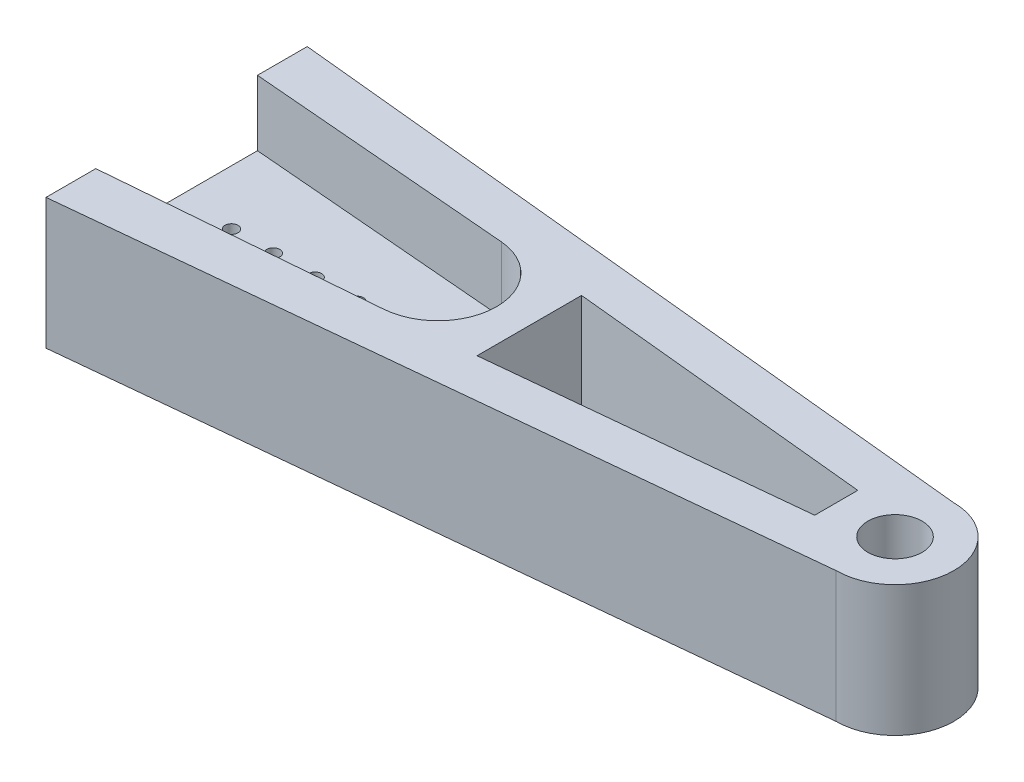
ISO-10303-21;
HEADER;
FILE_DESCRIPTION(('STEP AP214'),'2;1');
FILE_NAME('part.step','',(''),(''),'','','');
FILE_SCHEMA(('AUTOMOTIVE_DESIGN { 1 0 10303 214 1 1 1 1 }'));
ENDSEC;
DATA;
#1=APPLICATION_CONTEXT('core data for automotive mechanical design processes');
#2=APPLICATION_PROTOCOL_DEFINITION('international standard','automotive_design',2000,#1);
#3=PRODUCT_CONTEXT('',#1,'mechanical');
#4=PRODUCT('Part','Part','',(#3));
#5=PRODUCT_RELATED_PRODUCT_CATEGORY('part','',(#4));
#6=PRODUCT_DEFINITION_FORMATION('','',#4);
#7=PRODUCT_DEFINITION_CONTEXT('part definition',#1,'design');
#8=PRODUCT_DEFINITION('design','',#6,#7);
#9=PRODUCT_DEFINITION_SHAPE('','',#8);
#10=(LENGTH_UNIT() NAMED_UNIT(*) SI_UNIT(.MILLI.,.METRE.));
#11=(NAMED_UNIT(*) PLANE_ANGLE_UNIT() SI_UNIT($,.RADIAN.));
#12=(NAMED_UNIT(*) SI_UNIT($,.STERADIAN.) SOLID_ANGLE_UNIT());
#13=UNCERTAINTY_MEASURE_WITH_UNIT(LENGTH_MEASURE(1.E-05),#10,'distance_accuracy_value','');
#14=(GEOMETRIC_REPRESENTATION_CONTEXT(3) GLOBAL_UNCERTAINTY_ASSIGNED_CONTEXT((#13)) GLOBAL_UNIT_ASSIGNED_CONTEXT((#10,
#11,#12)) REPRESENTATION_CONTEXT('',''));
#15=CARTESIAN_POINT('',(0.,0.,0.));
#16=DIRECTION('',(0.,0.,1.));
#17=DIRECTION('',(1.,0.,0.));
#18=AXIS2_PLACEMENT_3D('',#15,#16,#17);
#19=CARTESIAN_POINT('',(0.,0.,0.));
#20=DIRECTION('',(0.,1.,0.));
#21=DIRECTION('',(0.,0.,1.));
#22=AXIS2_PLACEMENT_3D('',#19,#20,#21);
#23=PLANE('',#22);
#24=CARTESIAN_POINT('',(65.,0.,0.));
#25=DIRECTION('',(0.,1.,0.));
#26=DIRECTION('',(0.,0.,1.));
#27=AXIS2_PLACEMENT_3D('',#24,#25,#26);
#28=CIRCLE('',#27,2.07499999999999);
#29=CARTESIAN_POINT('',(65.,0.,2.07499999999999));
#30=VERTEX_POINT('',#29);
#31=EDGE_CURVE('E264',#30,#30,#28,.T.);
#32=ORIENTED_EDGE('',*,*,#31,.T.);
#33=EDGE_LOOP('',(#32));
#34=FACE_BOUND('',#33,.T.);
#35=CARTESIAN_POINT('',(65.,0.,0.));
#36=DIRECTION('',(0.,1.,0.));
#37=DIRECTION('',(0.,0.,1.));
#38=AXIS2_PLACEMENT_3D('',#35,#36,#37);
#39=CIRCLE('',#38,2.1);
#40=CARTESIAN_POINT('',(65.,0.,2.1));
#41=VERTEX_POINT('',#40);
#42=EDGE_CURVE('E11',#41,#41,#39,.T.);
#43=ORIENTED_EDGE('',*,*,#42,.F.);
#44=EDGE_LOOP('',(#43));
#45=FACE_BOUND('',#44,.T.);
#46=ADVANCED_FACE('F49',(#34,#45),#23,.F.);
#47=CARTESIAN_POINT('',(65.,5.,0.));
#48=DIRECTION('',(0.,-1.,0.));
#49=DIRECTION('',(0.,0.,-1.));
#50=AXIS2_PLACEMENT_3D('',#47,#48,#49);
#51=CYLINDRICAL_SURFACE('',#50,4.5);
#52=DIRECTION('',(0.,-1.,0.));
#53=VECTOR('',#52,1.);
#54=CARTESIAN_POINT('',(65.,5.,4.5));
#55=LINE('',#54,#53);
#56=CARTESIAN_POINT('',(65.,5.,4.5));
#57=VERTEX_POINT('',#56);
#58=CARTESIAN_POINT('',(65.,-5.,4.5));
#59=VERTEX_POINT('',#58);
#60=EDGE_CURVE('E291',#57,#59,#55,.T.);
#61=ORIENTED_EDGE('',*,*,#60,.T.);
#62=CARTESIAN_POINT('',(65.,-5.,0.));
#63=DIRECTION('',(0.,1.,0.));
#64=DIRECTION('',(0.,0.,-1.));
#65=AXIS2_PLACEMENT_3D('',#62,#63,#64);
#66=CIRCLE('',#65,4.5);
#67=CARTESIAN_POINT('',(65.,-5.,-4.5));
#68=VERTEX_POINT('',#67);
#69=EDGE_CURVE('E252',#59,#68,#66,.T.);
#70=ORIENTED_EDGE('',*,*,#69,.T.);
#71=DIRECTION('',(0.,-1.,0.));
#72=VECTOR('',#71,1.);
#73=CARTESIAN_POINT('',(65.,5.,-4.5));
#74=LINE('',#73,#72);
#75=CARTESIAN_POINT('',(65.,5.,-4.5));
#76=VERTEX_POINT('',#75);
#77=EDGE_CURVE('E53',#76,#68,#74,.T.);
#78=ORIENTED_EDGE('',*,*,#77,.F.);
#79=CARTESIAN_POINT('',(65.,5.,0.));
#80=DIRECTION('',(0.,1.,0.));
#81=DIRECTION('',(0.,0.,1.));
#82=AXIS2_PLACEMENT_3D('',#79,#80,#81);
#83=CIRCLE('',#82,4.5);
#84=EDGE_CURVE('E259',#76,#57,#83,.F.);
#85=ORIENTED_EDGE('',*,*,#84,.T.);
#86=EDGE_LOOP('',(#61,#70,#78,#85));
#87=FACE_BOUND('',#86,.T.);
#88=ADVANCED_FACE('F51',(#87),#51,.T.);
#89=CARTESIAN_POINT('',(1.08910891089109,5.,-10.8910891089109));
#90=DIRECTION('',(0.0995037190209989,0.,-0.995037190209989));
#91=DIRECTION('',(-0.995037190209989,0.,-0.0995037190209989));
#92=AXIS2_PLACEMENT_3D('',#89,#90,#91);
#93=PLANE('',#92);
#94=ORIENTED_EDGE('',*,*,#77,.T.);
#95=DIRECTION('',(-0.995037190209989,0.,-0.0995037190209989));
#96=VECTOR('',#95,1.);
#97=CARTESIAN_POINT('',(10.,-5.,-10.));
#98=LINE('',#97,#96);
#99=CARTESIAN_POINT('',(10.,-5.,-10.));
#100=VERTEX_POINT('',#99);
#101=EDGE_CURVE('E240',#68,#100,#98,.T.);
#102=ORIENTED_EDGE('',*,*,#101,.T.);
#103=DIRECTION('',(0.,-1.,0.));
#104=VECTOR('',#103,1.);
#105=CARTESIAN_POINT('',(10.,5.,-10.));
#106=LINE('',#105,#104);
#107=CARTESIAN_POINT('',(10.,5.,-10.));
#108=VERTEX_POINT('',#107);
#109=EDGE_CURVE('E325',#108,#100,#106,.T.);
#110=ORIENTED_EDGE('',*,*,#109,.F.);
#111=DIRECTION('',(0.995037190209989,0.,0.0995037190209989));
#112=VECTOR('',#111,1.);
#113=CARTESIAN_POINT('',(1.08910891089109,5.,-10.8910891089109));
#114=LINE('',#113,#112);
#115=EDGE_CURVE('E263',#108,#76,#114,.T.);
#116=ORIENTED_EDGE('',*,*,#115,.T.);
#117=EDGE_LOOP('',(#94,#102,#110,#116));
#118=FACE_BOUND('',#117,.T.);
#119=ADVANCED_FACE('F333',(#118),#93,.T.);
#120=CARTESIAN_POINT('',(0.583333333333335,5.,-6.97565210014248));
#121=DIRECTION('',(0.0833333333333335,0.,-0.996521728591783));
#122=DIRECTION('',(-0.996521728591783,0.,-0.0833333333333335));
#123=AXIS2_PLACEMENT_3D('',#120,#121,#122);
#124=PLANE('',#123);
#125=DIRECTION('',(0.996521728591783,0.,0.0833333333333335));
#126=VECTOR('',#125,1.);
#127=CARTESIAN_POINT('',(0.583333333333335,0.,-6.97565210014248));
#128=LINE('',#127,#126);
#129=CARTESIAN_POINT('',(10.,0.,-6.18819087405247));
#130=VERTEX_POINT('',#129);
#131=CARTESIAN_POINT('',(30.375,0.,-4.48434777866302));
#132=VERTEX_POINT('',#131);
#133=EDGE_CURVE('E256',#130,#132,#128,.T.);
#134=ORIENTED_EDGE('',*,*,#133,.T.);
#135=DIRECTION('',(0.,-1.,0.));
#136=VECTOR('',#135,1.);
#137=CARTESIAN_POINT('',(30.375,5.,-4.48434777866302));
#138=LINE('',#137,#136);
#139=CARTESIAN_POINT('',(30.375,5.,-4.48434777866302));
#140=VERTEX_POINT('',#139);
#141=EDGE_CURVE('E318',#140,#132,#138,.T.);
#142=ORIENTED_EDGE('',*,*,#141,.F.);
#143=DIRECTION('',(0.996521728591783,0.,0.0833333333333335));
#144=VECTOR('',#143,1.);
#145=CARTESIAN_POINT('',(0.583333333333335,5.,-6.97565210014248));
#146=LINE('',#145,#144);
#147=CARTESIAN_POINT('',(10.,5.,-6.18819087405247));
#148=VERTEX_POINT('',#147);
#149=EDGE_CURVE('E271',#148,#140,#146,.T.);
#150=ORIENTED_EDGE('',*,*,#149,.F.);
#151=DIRECTION('',(0.,-1.,0.));
#152=VECTOR('',#151,1.);
#153=CARTESIAN_POINT('',(10.,5.,-6.18819087405247));
#154=LINE('',#153,#152);
#155=EDGE_CURVE('E322',#148,#130,#154,.T.);
#156=ORIENTED_EDGE('',*,*,#155,.T.);
#157=EDGE_LOOP('',(#134,#142,#150,#156));
#158=FACE_BOUND('',#157,.T.);
#159=ADVANCED_FACE('F360',(#158),#124,.F.);
#160=CARTESIAN_POINT('',(30.,5.,0.));
#161=DIRECTION('',(0.,-1.,0.));
#162=DIRECTION('',(0.,0.,-1.));
#163=AXIS2_PLACEMENT_3D('',#160,#161,#162);
#164=CYLINDRICAL_SURFACE('',#163,4.5);
#165=CARTESIAN_POINT('',(30.,0.,0.));
#166=DIRECTION('',(0.,1.,0.));
#167=DIRECTION('',(0.,0.,1.));
#168=AXIS2_PLACEMENT_3D('',#165,#166,#167);
#169=CIRCLE('',#168,4.5);
#170=CARTESIAN_POINT('',(30.375,0.,4.48434777866302));
#171=VERTEX_POINT('',#170);
#172=EDGE_CURVE('E295',#132,#171,#169,.F.);
#173=ORIENTED_EDGE('',*,*,#172,.T.);
#174=DIRECTION('',(0.,-1.,0.));
#175=VECTOR('',#174,1.);
#176=CARTESIAN_POINT('',(30.375,5.,4.48434777866302));
#177=LINE('',#176,#175);
#178=CARTESIAN_POINT('',(30.375,5.,4.48434777866302));
#179=VERTEX_POINT('',#178);
#180=EDGE_CURVE('E314',#179,#171,#177,.T.);
#181=ORIENTED_EDGE('',*,*,#180,.F.);
#182=CARTESIAN_POINT('',(30.,5.,0.));
#183=DIRECTION('',(0.,1.,0.));
#184=DIRECTION('',(0.,0.,1.));
#185=AXIS2_PLACEMENT_3D('',#182,#183,#184);
#186=CIRCLE('',#185,4.5);
#187=EDGE_CURVE('E274',#140,#179,#186,.F.);
#188=ORIENTED_EDGE('',*,*,#187,.F.);
#189=ORIENTED_EDGE('',*,*,#141,.T.);
#190=EDGE_LOOP('',(#173,#181,#188,#189));
#191=FACE_BOUND('',#190,.T.);
#192=ADVANCED_FACE('F363',(#191),#164,.F.);
#193=CARTESIAN_POINT('',(0.583333333333332,5.,6.97565210014248));
#194=DIRECTION('',(-0.0833333333333332,0.,-0.996521728591783));
#195=DIRECTION('',(-0.996521728591783,0.,0.0833333333333332));
#196=AXIS2_PLACEMENT_3D('',#193,#194,#195);
#197=PLANE('',#196);
#198=DIRECTION('',(0.996521728591783,0.,-0.0833333333333332));
#199=VECTOR('',#198,1.);
#200=CARTESIAN_POINT('',(0.583333333333332,0.,6.97565210014248));
#201=LINE('',#200,#199);
#202=CARTESIAN_POINT('',(10.,0.,6.18819087405246));
#203=VERTEX_POINT('',#202);
#204=EDGE_CURVE('E299',#203,#171,#201,.T.);
#205=ORIENTED_EDGE('',*,*,#204,.F.);
#206=DIRECTION('',(0.,-1.,0.));
#207=VECTOR('',#206,1.);
#208=CARTESIAN_POINT('',(10.,5.,6.18819087405247));
#209=LINE('',#208,#207);
#210=CARTESIAN_POINT('',(10.,5.,6.18819087405247));
#211=VERTEX_POINT('',#210);
#212=EDGE_CURVE('E310',#211,#203,#209,.T.);
#213=ORIENTED_EDGE('',*,*,#212,.F.);
#214=DIRECTION('',(0.996521728591783,0.,-0.0833333333333332));
#215=VECTOR('',#214,1.);
#216=CARTESIAN_POINT('',(0.583333333333332,5.,6.97565210014248));
#217=LINE('',#216,#215);
#218=EDGE_CURVE('E277',#211,#179,#217,.T.);
#219=ORIENTED_EDGE('',*,*,#218,.T.);
#220=ORIENTED_EDGE('',*,*,#180,.T.);
#221=EDGE_LOOP('',(#205,#213,#219,#220));
#222=FACE_BOUND('',#221,.T.);
#223=ADVANCED_FACE('F354',(#222),#197,.T.);
#224=CARTESIAN_POINT('',(10.,5.,0.));
#225=DIRECTION('',(1.,0.,0.));
#226=DIRECTION('',(0.,0.,-1.));
#227=AXIS2_PLACEMENT_3D('',#224,#225,#226);
#228=PLANE('',#227);
#229=ORIENTED_EDGE('',*,*,#212,.T.);
#230=DIRECTION('',(0.,0.,1.));
#231=VECTOR('',#230,1.);
#232=CARTESIAN_POINT('',(10.,0.,-10.));
#233=LINE('',#232,#231);
#234=EDGE_CURVE('E236',#130,#203,#233,.T.);
#235=ORIENTED_EDGE('',*,*,#234,.F.);
#236=ORIENTED_EDGE('',*,*,#155,.F.);
#237=DIRECTION('',(0.,0.,1.));
#238=VECTOR('',#237,1.);
#239=CARTESIAN_POINT('',(10.,5.,0.));
#240=LINE('',#239,#238);
#241=EDGE_CURVE('E268',#108,#148,#240,.T.);
#242=ORIENTED_EDGE('',*,*,#241,.F.);
#243=ORIENTED_EDGE('',*,*,#109,.T.);
#244=DIRECTION('',(0.,0.,1.));
#245=VECTOR('',#244,1.);
#246=CARTESIAN_POINT('',(10.,-5.,-10.));
#247=LINE('',#246,#245);
#248=CARTESIAN_POINT('',(10.,-5.,10.));
#249=VERTEX_POINT('',#248);
#250=EDGE_CURVE('E244',#100,#249,#247,.T.);
#251=ORIENTED_EDGE('',*,*,#250,.T.);
#252=DIRECTION('',(0.,-1.,0.));
#253=VECTOR('',#252,1.);
#254=CARTESIAN_POINT('',(10.,5.,10.));
#255=LINE('',#254,#253);
#256=CARTESIAN_POINT('',(10.,5.,10.));
#257=VERTEX_POINT('',#256);
#258=EDGE_CURVE('E307',#257,#249,#255,.T.);
#259=ORIENTED_EDGE('',*,*,#258,.F.);
#260=DIRECTION('',(0.,0.,1.));
#261=VECTOR('',#260,1.);
#262=CARTESIAN_POINT('',(10.,5.,0.));
#263=LINE('',#262,#261);
#264=EDGE_CURVE('E281',#211,#257,#263,.T.);
#265=ORIENTED_EDGE('',*,*,#264,.F.);
#266=EDGE_LOOP('',(#229,#235,#236,#242,#243,#251,#259,#265));
#267=FACE_BOUND('',#266,.T.);
#268=ADVANCED_FACE('F346',(#267),#228,.F.);
#269=CARTESIAN_POINT('',(1.08910891089109,5.,10.8910891089109));
#270=DIRECTION('',(-0.0995037190209989,0.,-0.995037190209989));
#271=DIRECTION('',(-0.995037190209989,0.,0.0995037190209989));
#272=AXIS2_PLACEMENT_3D('',#269,#270,#271);
#273=PLANE('',#272);
#274=ORIENTED_EDGE('',*,*,#258,.T.);
#275=DIRECTION('',(0.995037190209989,0.,-0.0995037190209988));
#276=VECTOR('',#275,1.);
#277=CARTESIAN_POINT('',(10.,-5.,10.));
#278=LINE('',#277,#276);
#279=EDGE_CURVE('E248',#249,#59,#278,.T.);
#280=ORIENTED_EDGE('',*,*,#279,.T.);
#281=ORIENTED_EDGE('',*,*,#60,.F.);
#282=DIRECTION('',(0.995037190209989,0.,-0.0995037190209989));
#283=VECTOR('',#282,1.);
#284=CARTESIAN_POINT('',(1.08910891089109,5.,10.8910891089109));
#285=LINE('',#284,#283);
#286=EDGE_CURVE('E284',#257,#57,#285,.T.);
#287=ORIENTED_EDGE('',*,*,#286,.F.);
#288=EDGE_LOOP('',(#274,#280,#281,#287));
#289=FACE_BOUND('',#288,.T.);
#290=ADVANCED_FACE('F344',(#289),#273,.F.);
#291=CARTESIAN_POINT('',(65.,5.,0.));
#292=DIRECTION('',(0.,-1.,0.));
#293=DIRECTION('',(0.,0.,-1.));
#294=AXIS2_PLACEMENT_3D('',#291,#292,#293);
#295=CYLINDRICAL_SURFACE('',#294,2.07499999999999);
#296=CARTESIAN_POINT('',(65.,5.,0.));
#297=DIRECTION('',(0.,1.,0.));
#298=DIRECTION('',(0.,0.,1.));
#299=AXIS2_PLACEMENT_3D('',#296,#297,#298);
#300=CIRCLE('',#299,2.07499999999999);
#301=CARTESIAN_POINT('',(65.,5.,2.07499999999999));
#302=VERTEX_POINT('',#301);
#303=EDGE_CURVE('E287',#302,#302,#300,.T.);
#304=ORIENTED_EDGE('',*,*,#303,.T.);
#305=EDGE_LOOP('',(#304));
#306=FACE_BOUND('',#305,.T.);
#307=ORIENTED_EDGE('',*,*,#31,.F.);
#308=EDGE_LOOP('',(#307));
#309=FACE_BOUND('',#308,.T.);
#310=ADVANCED_FACE('F377',(#306,#309),#295,.F.);
#311=CARTESIAN_POINT('',(0.,5.,0.));
#312=DIRECTION('',(0.,1.,0.));
#313=DIRECTION('',(0.,0.,1.));
#314=AXIS2_PLACEMENT_3D('',#311,#312,#313);
#315=PLANE('',#314);
#316=DIRECTION('',(-0.995037190209989,0.,-0.0995037190209988));
#317=VECTOR('',#316,1.);
#318=CARTESIAN_POINT('',(60.5,5.,-1.65));
#319=LINE('',#318,#317);
#320=CARTESIAN_POINT('',(60.5,5.,-1.65));
#321=VERTEX_POINT('',#320);
#322=CARTESIAN_POINT('',(37.,5.,-4.));
#323=VERTEX_POINT('',#322);
#324=EDGE_CURVE('E66',#321,#323,#319,.T.);
#325=ORIENTED_EDGE('',*,*,#324,.F.);
#326=DIRECTION('',(0.,0.,-1.));
#327=VECTOR('',#326,1.);
#328=CARTESIAN_POINT('',(60.5,5.,1.65));
#329=LINE('',#328,#327);
#330=CARTESIAN_POINT('',(60.5,5.,1.65));
#331=VERTEX_POINT('',#330);
#332=EDGE_CURVE('E160',#331,#321,#329,.T.);
#333=ORIENTED_EDGE('',*,*,#332,.F.);
#334=DIRECTION('',(0.995037190209989,0.,-0.0995037190209989));
#335=VECTOR('',#334,1.);
#336=CARTESIAN_POINT('',(37.,5.,4.));
#337=LINE('',#336,#335);
#338=CARTESIAN_POINT('',(37.,5.,4.));
#339=VERTEX_POINT('',#338);
#340=EDGE_CURVE('E142',#339,#331,#337,.T.);
#341=ORIENTED_EDGE('',*,*,#340,.F.);
#342=DIRECTION('',(0.,0.,1.));
#343=VECTOR('',#342,1.);
#344=CARTESIAN_POINT('',(37.,5.,-4.));
#345=LINE('',#344,#343);
#346=EDGE_CURVE('E152',#323,#339,#345,.T.);
#347=ORIENTED_EDGE('',*,*,#346,.F.);
#348=EDGE_LOOP('',(#325,#333,#341,#347));
#349=FACE_BOUND('',#348,.T.);
#350=ORIENTED_EDGE('',*,*,#84,.F.);
#351=ORIENTED_EDGE('',*,*,#115,.F.);
#352=ORIENTED_EDGE('',*,*,#241,.T.);
#353=ORIENTED_EDGE('',*,*,#149,.T.);
#354=ORIENTED_EDGE('',*,*,#187,.T.);
#355=ORIENTED_EDGE('',*,*,#218,.F.);
#356=ORIENTED_EDGE('',*,*,#264,.T.);
#357=ORIENTED_EDGE('',*,*,#286,.T.);
#358=EDGE_LOOP('',(#350,#351,#352,#353,#354,#355,#356,#357));
#359=FACE_BOUND('',#358,.T.);
#360=ORIENTED_EDGE('',*,*,#303,.F.);
#361=EDGE_LOOP('',(#360));
#362=FACE_BOUND('',#361,.T.);
#363=ADVANCED_FACE('F157',(#349,#359,#362),#315,.T.);
#364=CARTESIAN_POINT('',(65.,0.,0.));
#365=DIRECTION('',(0.,-1.,0.));
#366=DIRECTION('',(0.,0.,-1.));
#367=AXIS2_PLACEMENT_3D('',#364,#365,#366);
#368=PLANE('',#367);
#369=CARTESIAN_POINT('',(14.2,0.,0.));
#370=DIRECTION('',(0.,1.,0.));
#371=DIRECTION('',(0.,0.,1.));
#372=AXIS2_PLACEMENT_3D('',#369,#370,#371);
#373=CIRCLE('',#372,0.500000000000001);
#374=CARTESIAN_POINT('',(14.2,0.,0.500000000000001));
#375=VERTEX_POINT('',#374);
#376=EDGE_CURVE('E230',#375,#375,#373,.T.);
#377=ORIENTED_EDGE('',*,*,#376,.F.);
#378=EDGE_LOOP('',(#377));
#379=FACE_BOUND('',#378,.T.);
#380=CARTESIAN_POINT('',(17.4,0.,0.));
#381=DIRECTION('',(0.,1.,0.));
#382=DIRECTION('',(0.,0.,1.));
#383=AXIS2_PLACEMENT_3D('',#380,#381,#382);
#384=CIRCLE('',#383,0.499999999999999);
#385=CARTESIAN_POINT('',(17.4,0.,0.499999999999999));
#386=VERTEX_POINT('',#385);
#387=EDGE_CURVE('E216',#386,#386,#384,.T.);
#388=ORIENTED_EDGE('',*,*,#387,.F.);
#389=EDGE_LOOP('',(#388));
#390=FACE_BOUND('',#389,.T.);
#391=CARTESIAN_POINT('',(20.6,0.,0.));
#392=DIRECTION('',(0.,1.,0.));
#393=DIRECTION('',(0.,0.,1.));
#394=AXIS2_PLACEMENT_3D('',#391,#392,#393);
#395=CIRCLE('',#394,0.500000000000002);
#396=CARTESIAN_POINT('',(20.6,0.,0.500000000000002));
#397=VERTEX_POINT('',#396);
#398=EDGE_CURVE('E208',#397,#397,#395,.T.);
#399=ORIENTED_EDGE('',*,*,#398,.F.);
#400=EDGE_LOOP('',(#399));
#401=FACE_BOUND('',#400,.T.);
#402=CARTESIAN_POINT('',(23.8,0.,0.));
#403=DIRECTION('',(0.,1.,0.));
#404=DIRECTION('',(0.,0.,1.));
#405=AXIS2_PLACEMENT_3D('',#402,#403,#404);
#406=CIRCLE('',#405,0.500000000000002);
#407=CARTESIAN_POINT('',(23.8,0.,0.500000000000002));
#408=VERTEX_POINT('',#407);
#409=EDGE_CURVE('E200',#408,#408,#406,.T.);
#410=ORIENTED_EDGE('',*,*,#409,.F.);
#411=EDGE_LOOP('',(#410));
#412=FACE_BOUND('',#411,.T.);
#413=CARTESIAN_POINT('',(27.,0.,0.));
#414=DIRECTION('',(0.,1.,0.));
#415=DIRECTION('',(0.,0.,1.));
#416=AXIS2_PLACEMENT_3D('',#413,#414,#415);
#417=CIRCLE('',#416,0.500000000000002);
#418=CARTESIAN_POINT('',(27.,0.,0.500000000000002));
#419=VERTEX_POINT('',#418);
#420=EDGE_CURVE('E192',#419,#419,#417,.T.);
#421=ORIENTED_EDGE('',*,*,#420,.F.);
#422=EDGE_LOOP('',(#421));
#423=FACE_BOUND('',#422,.T.);
#424=CARTESIAN_POINT('',(30.2,0.,0.));
#425=DIRECTION('',(0.,1.,0.));
#426=DIRECTION('',(0.,0.,1.));
#427=AXIS2_PLACEMENT_3D('',#424,#425,#426);
#428=CIRCLE('',#427,0.499999999999999);
#429=CARTESIAN_POINT('',(30.2,0.,0.499999999999999));
#430=VERTEX_POINT('',#429);
#431=EDGE_CURVE('E183',#430,#430,#428,.T.);
#432=ORIENTED_EDGE('',*,*,#431,.F.);
#433=EDGE_LOOP('',(#432));
#434=FACE_BOUND('',#433,.T.);
#435=ORIENTED_EDGE('',*,*,#234,.T.);
#436=ORIENTED_EDGE('',*,*,#204,.T.);
#437=ORIENTED_EDGE('',*,*,#172,.F.);
#438=ORIENTED_EDGE('',*,*,#133,.F.);
#439=EDGE_LOOP('',(#435,#436,#437,#438));
#440=FACE_BOUND('',#439,.T.);
#441=ADVANCED_FACE('F364',(#379,#390,#401,#412,#423,#434,#440),#368,.F.);
#442=CARTESIAN_POINT('',(65.,-5.,0.));
#443=DIRECTION('',(0.,-1.,0.));
#444=DIRECTION('',(0.,0.,-1.));
#445=AXIS2_PLACEMENT_3D('',#442,#443,#444);
#446=PLANE('',#445);
#447=DIRECTION('',(-0.995037190209989,0.,-0.0995037190209988));
#448=VECTOR('',#447,1.);
#449=CARTESIAN_POINT('',(60.5,-5.,-1.65));
#450=LINE('',#449,#448);
#451=CARTESIAN_POINT('',(60.5,-5.,-1.65));
#452=VERTEX_POINT('',#451);
#453=CARTESIAN_POINT('',(37.,-5.,-4.));
#454=VERTEX_POINT('',#453);
#455=EDGE_CURVE('E164',#452,#454,#450,.T.);
#456=ORIENTED_EDGE('',*,*,#455,.T.);
#457=DIRECTION('',(0.,0.,1.));
#458=VECTOR('',#457,1.);
#459=CARTESIAN_POINT('',(37.,-5.,-4.));
#460=LINE('',#459,#458);
#461=CARTESIAN_POINT('',(37.,-5.,4.));
#462=VERTEX_POINT('',#461);
#463=EDGE_CURVE('E171',#454,#462,#460,.T.);
#464=ORIENTED_EDGE('',*,*,#463,.T.);
#465=DIRECTION('',(0.995037190209989,0.,-0.0995037190209989));
#466=VECTOR('',#465,1.);
#467=CARTESIAN_POINT('',(37.,-5.,4.));
#468=LINE('',#467,#466);
#469=CARTESIAN_POINT('',(60.5,-5.,1.65));
#470=VERTEX_POINT('',#469);
#471=EDGE_CURVE('E74',#462,#470,#468,.T.);
#472=ORIENTED_EDGE('',*,*,#471,.T.);
#473=DIRECTION('',(0.,0.,-1.));
#474=VECTOR('',#473,1.);
#475=CARTESIAN_POINT('',(60.5,-5.,1.65));
#476=LINE('',#475,#474);
#477=EDGE_CURVE('E176',#470,#452,#476,.T.);
#478=ORIENTED_EDGE('',*,*,#477,.T.);
#479=EDGE_LOOP('',(#456,#464,#472,#478));
#480=FACE_BOUND('',#479,.T.);
#481=CARTESIAN_POINT('',(30.2,-5.,0.));
#482=DIRECTION('',(0.,1.,0.));
#483=DIRECTION('',(0.,0.,1.));
#484=AXIS2_PLACEMENT_3D('',#481,#482,#483);
#485=CIRCLE('',#484,0.499999999999999);
#486=CARTESIAN_POINT('',(30.2,-5.,0.499999999999999));
#487=VERTEX_POINT('',#486);
#488=EDGE_CURVE('E188',#487,#487,#485,.T.);
#489=ORIENTED_EDGE('',*,*,#488,.T.);
#490=EDGE_LOOP('',(#489));
#491=FACE_BOUND('',#490,.T.);
#492=CARTESIAN_POINT('',(27.,-5.,0.));
#493=DIRECTION('',(0.,1.,0.));
#494=DIRECTION('',(0.,0.,1.));
#495=AXIS2_PLACEMENT_3D('',#492,#493,#494);
#496=CIRCLE('',#495,0.500000000000002);
#497=CARTESIAN_POINT('',(27.,-5.,0.500000000000002));
#498=VERTEX_POINT('',#497);
#499=EDGE_CURVE('E196',#498,#498,#496,.T.);
#500=ORIENTED_EDGE('',*,*,#499,.T.);
#501=EDGE_LOOP('',(#500));
#502=FACE_BOUND('',#501,.T.);
#503=CARTESIAN_POINT('',(23.8,-5.,0.));
#504=DIRECTION('',(0.,1.,0.));
#505=DIRECTION('',(0.,0.,1.));
#506=AXIS2_PLACEMENT_3D('',#503,#504,#505);
#507=CIRCLE('',#506,0.500000000000002);
#508=CARTESIAN_POINT('',(23.8,-5.,0.500000000000002));
#509=VERTEX_POINT('',#508);
#510=EDGE_CURVE('E204',#509,#509,#507,.T.);
#511=ORIENTED_EDGE('',*,*,#510,.T.);
#512=EDGE_LOOP('',(#511));
#513=FACE_BOUND('',#512,.T.);
#514=CARTESIAN_POINT('',(20.6,-5.,0.));
#515=DIRECTION('',(0.,1.,0.));
#516=DIRECTION('',(0.,0.,1.));
#517=AXIS2_PLACEMENT_3D('',#514,#515,#516);
#518=CIRCLE('',#517,0.500000000000002);
#519=CARTESIAN_POINT('',(20.6,-5.,0.500000000000002));
#520=VERTEX_POINT('',#519);
#521=EDGE_CURVE('E212',#520,#520,#518,.T.);
#522=ORIENTED_EDGE('',*,*,#521,.T.);
#523=EDGE_LOOP('',(#522));
#524=FACE_BOUND('',#523,.T.);
#525=CARTESIAN_POINT('',(17.4,-5.,0.));
#526=DIRECTION('',(0.,1.,0.));
#527=DIRECTION('',(0.,0.,1.));
#528=AXIS2_PLACEMENT_3D('',#525,#526,#527);
#529=CIRCLE('',#528,0.499999999999999);
#530=CARTESIAN_POINT('',(17.4,-5.,0.499999999999999));
#531=VERTEX_POINT('',#530);
#532=EDGE_CURVE('E220',#531,#531,#529,.T.);
#533=ORIENTED_EDGE('',*,*,#532,.T.);
#534=EDGE_LOOP('',(#533));
#535=FACE_BOUND('',#534,.T.);
#536=CARTESIAN_POINT('',(65.,-5.,0.));
#537=DIRECTION('',(0.,1.,0.));
#538=DIRECTION('',(0.,0.,1.));
#539=AXIS2_PLACEMENT_3D('',#536,#537,#538);
#540=CIRCLE('',#539,2.1);
#541=CARTESIAN_POINT('',(65.,-5.,2.1));
#542=VERTEX_POINT('',#541);
#543=EDGE_CURVE('E224',#542,#542,#540,.T.);
#544=ORIENTED_EDGE('',*,*,#543,.T.);
#545=EDGE_LOOP('',(#544));
#546=FACE_BOUND('',#545,.T.);
#547=CARTESIAN_POINT('',(14.2,-5.,0.));
#548=DIRECTION('',(0.,1.,0.));
#549=DIRECTION('',(0.,0.,1.));
#550=AXIS2_PLACEMENT_3D('',#547,#548,#549);
#551=CIRCLE('',#550,0.500000000000001);
#552=CARTESIAN_POINT('',(14.2,-5.,0.500000000000001));
#553=VERTEX_POINT('',#552);
#554=EDGE_CURVE('E232',#553,#553,#551,.T.);
#555=ORIENTED_EDGE('',*,*,#554,.T.);
#556=EDGE_LOOP('',(#555));
#557=FACE_BOUND('',#556,.T.);
#558=ORIENTED_EDGE('',*,*,#101,.F.);
#559=ORIENTED_EDGE('',*,*,#69,.F.);
#560=ORIENTED_EDGE('',*,*,#279,.F.);
#561=ORIENTED_EDGE('',*,*,#250,.F.);
#562=EDGE_LOOP('',(#558,#559,#560,#561));
#563=FACE_BOUND('',#562,.T.);
#564=ADVANCED_FACE('F339',(#480,#491,#502,#513,#524,#535,#546,#557,#563),#446,.T.);
#565=CARTESIAN_POINT('',(14.2,-5.,0.));
#566=DIRECTION('',(0.,1.,0.));
#567=DIRECTION('',(0.,0.,1.));
#568=AXIS2_PLACEMENT_3D('',#565,#566,#567);
#569=CYLINDRICAL_SURFACE('',#568,0.500000000000001);
#570=ORIENTED_EDGE('',*,*,#554,.F.);
#571=EDGE_LOOP('',(#570));
#572=FACE_BOUND('',#571,.T.);
#573=ORIENTED_EDGE('',*,*,#376,.T.);
#574=EDGE_LOOP('',(#573));
#575=FACE_BOUND('',#574,.T.);
#576=ADVANCED_FACE('F373',(#572,#575),#569,.F.);
#577=CARTESIAN_POINT('',(65.,-5.,0.));
#578=DIRECTION('',(0.,1.,0.));
#579=DIRECTION('',(0.,0.,1.));
#580=AXIS2_PLACEMENT_3D('',#577,#578,#579);
#581=CYLINDRICAL_SURFACE('',#580,2.1);
#582=ORIENTED_EDGE('',*,*,#543,.F.);
#583=EDGE_LOOP('',(#582));
#584=FACE_BOUND('',#583,.T.);
#585=ORIENTED_EDGE('',*,*,#42,.T.);
#586=EDGE_LOOP('',(#585));
#587=FACE_BOUND('',#586,.T.);
#588=ADVANCED_FACE('F455',(#584,#587),#581,.F.);
#589=CARTESIAN_POINT('',(17.4,-5.,0.));
#590=DIRECTION('',(0.,1.,0.));
#591=DIRECTION('',(0.,0.,1.));
#592=AXIS2_PLACEMENT_3D('',#589,#590,#591);
#593=CYLINDRICAL_SURFACE('',#592,0.499999999999999);
#594=ORIENTED_EDGE('',*,*,#532,.F.);
#595=EDGE_LOOP('',(#594));
#596=FACE_BOUND('',#595,.T.);
#597=ORIENTED_EDGE('',*,*,#387,.T.);
#598=EDGE_LOOP('',(#597));
#599=FACE_BOUND('',#598,.T.);
#600=ADVANCED_FACE('F465',(#596,#599),#593,.F.);
#601=CARTESIAN_POINT('',(20.6,-5.,0.));
#602=DIRECTION('',(0.,1.,0.));
#603=DIRECTION('',(0.,0.,1.));
#604=AXIS2_PLACEMENT_3D('',#601,#602,#603);
#605=CYLINDRICAL_SURFACE('',#604,0.500000000000002);
#606=ORIENTED_EDGE('',*,*,#521,.F.);
#607=EDGE_LOOP('',(#606));
#608=FACE_BOUND('',#607,.T.);
#609=ORIENTED_EDGE('',*,*,#398,.T.);
#610=EDGE_LOOP('',(#609));
#611=FACE_BOUND('',#610,.T.);
#612=ADVANCED_FACE('F475',(#608,#611),#605,.F.);
#613=CARTESIAN_POINT('',(23.8,-5.,0.));
#614=DIRECTION('',(0.,1.,0.));
#615=DIRECTION('',(0.,0.,1.));
#616=AXIS2_PLACEMENT_3D('',#613,#614,#615);
#617=CYLINDRICAL_SURFACE('',#616,0.500000000000002);
#618=ORIENTED_EDGE('',*,*,#510,.F.);
#619=EDGE_LOOP('',(#618));
#620=FACE_BOUND('',#619,.T.);
#621=ORIENTED_EDGE('',*,*,#409,.T.);
#622=EDGE_LOOP('',(#621));
#623=FACE_BOUND('',#622,.T.);
#624=ADVANCED_FACE('F485',(#620,#623),#617,.F.);
#625=CARTESIAN_POINT('',(27.,-5.,0.));
#626=DIRECTION('',(0.,1.,0.));
#627=DIRECTION('',(0.,0.,1.));
#628=AXIS2_PLACEMENT_3D('',#625,#626,#627);
#629=CYLINDRICAL_SURFACE('',#628,0.500000000000002);
#630=ORIENTED_EDGE('',*,*,#499,.F.);
#631=EDGE_LOOP('',(#630));
#632=FACE_BOUND('',#631,.T.);
#633=ORIENTED_EDGE('',*,*,#420,.T.);
#634=EDGE_LOOP('',(#633));
#635=FACE_BOUND('',#634,.T.);
#636=ADVANCED_FACE('F495',(#632,#635),#629,.F.);
#637=CARTESIAN_POINT('',(30.2,-5.,0.));
#638=DIRECTION('',(0.,1.,0.));
#639=DIRECTION('',(0.,0.,1.));
#640=AXIS2_PLACEMENT_3D('',#637,#638,#639);
#641=CYLINDRICAL_SURFACE('',#640,0.499999999999999);
#642=ORIENTED_EDGE('',*,*,#488,.F.);
#643=EDGE_LOOP('',(#642));
#644=FACE_BOUND('',#643,.T.);
#645=ORIENTED_EDGE('',*,*,#431,.T.);
#646=EDGE_LOOP('',(#645));
#647=FACE_BOUND('',#646,.T.);
#648=ADVANCED_FACE('F505',(#644,#647),#641,.F.);
#649=CARTESIAN_POINT('',(60.5,-5.,-1.65));
#650=DIRECTION('',(0.0995037190209988,0.,-0.995037190209989));
#651=DIRECTION('',(-0.995037190209989,0.,-0.0995037190209988));
#652=AXIS2_PLACEMENT_3D('',#649,#650,#651);
#653=PLANE('',#652);
#654=DIRECTION('',(0.,1.,0.));
#655=VECTOR('',#654,1.);
#656=CARTESIAN_POINT('',(37.,-5.,-4.));
#657=LINE('',#656,#655);
#658=EDGE_CURVE('E149',#454,#323,#657,.T.);
#659=ORIENTED_EDGE('',*,*,#658,.F.);
#660=ORIENTED_EDGE('',*,*,#455,.F.);
#661=DIRECTION('',(0.,1.,0.));
#662=VECTOR('',#661,1.);
#663=CARTESIAN_POINT('',(60.5,-5.,-1.65));
#664=LINE('',#663,#662);
#665=EDGE_CURVE('E180',#452,#321,#664,.T.);
#666=ORIENTED_EDGE('',*,*,#665,.T.);
#667=ORIENTED_EDGE('',*,*,#324,.T.);
#668=EDGE_LOOP('',(#659,#660,#666,#667));
#669=FACE_BOUND('',#668,.T.);
#670=ADVANCED_FACE('F515',(#669),#653,.F.);
#671=CARTESIAN_POINT('',(60.5,-5.,1.65));
#672=DIRECTION('',(1.,0.,0.));
#673=DIRECTION('',(0.,0.,-1.));
#674=AXIS2_PLACEMENT_3D('',#671,#672,#673);
#675=PLANE('',#674);
#676=ORIENTED_EDGE('',*,*,#665,.F.);
#677=ORIENTED_EDGE('',*,*,#477,.F.);
#678=DIRECTION('',(0.,1.,0.));
#679=VECTOR('',#678,1.);
#680=CARTESIAN_POINT('',(60.5,-5.,1.65));
#681=LINE('',#680,#679);
#682=EDGE_CURVE('E148',#470,#331,#681,.T.);
#683=ORIENTED_EDGE('',*,*,#682,.T.);
#684=ORIENTED_EDGE('',*,*,#332,.T.);
#685=EDGE_LOOP('',(#676,#677,#683,#684));
#686=FACE_BOUND('',#685,.T.);
#687=ADVANCED_FACE('F524',(#686),#675,.F.);
#688=CARTESIAN_POINT('',(37.,-5.,4.));
#689=DIRECTION('',(0.099503719020999,0.,0.995037190209989));
#690=DIRECTION('',(0.995037190209989,0.,-0.099503719020999));
#691=AXIS2_PLACEMENT_3D('',#688,#689,#690);
#692=PLANE('',#691);
#693=ORIENTED_EDGE('',*,*,#682,.F.);
#694=ORIENTED_EDGE('',*,*,#471,.F.);
#695=DIRECTION('',(0.,1.,0.));
#696=VECTOR('',#695,1.);
#697=CARTESIAN_POINT('',(37.,-5.,4.));
#698=LINE('',#697,#696);
#699=EDGE_CURVE('E138',#462,#339,#698,.T.);
#700=ORIENTED_EDGE('',*,*,#699,.T.);
#701=ORIENTED_EDGE('',*,*,#340,.T.);
#702=EDGE_LOOP('',(#693,#694,#700,#701));
#703=FACE_BOUND('',#702,.T.);
#704=ADVANCED_FACE('F140',(#703),#692,.F.);
#705=CARTESIAN_POINT('',(37.,-5.,-4.));
#706=DIRECTION('',(-1.,0.,0.));
#707=DIRECTION('',(0.,0.,1.));
#708=AXIS2_PLACEMENT_3D('',#705,#706,#707);
#709=PLANE('',#708);
#710=ORIENTED_EDGE('',*,*,#699,.F.);
#711=ORIENTED_EDGE('',*,*,#463,.F.);
#712=ORIENTED_EDGE('',*,*,#658,.T.);
#713=ORIENTED_EDGE('',*,*,#346,.T.);
#714=EDGE_LOOP('',(#710,#711,#712,#713));
#715=FACE_BOUND('',#714,.T.);
#716=ADVANCED_FACE('F153',(#715),#709,.F.);
#717=CLOSED_SHELL('',(#46,#88,#119,#159,#192,#223,#268,#290,#310,#363,#441,#564,#576,#588,#600,
#612,#624,#636,#648,#670,#687,#704,#716));
#718=MANIFOLD_SOLID_BREP('B2',#717);
#719=ADVANCED_BREP_SHAPE_REPRESENTATION('',(#18,#718),#14);
#720=SHAPE_DEFINITION_REPRESENTATION(#9,#719);
ENDSEC;
END-ISO-10303-21;
